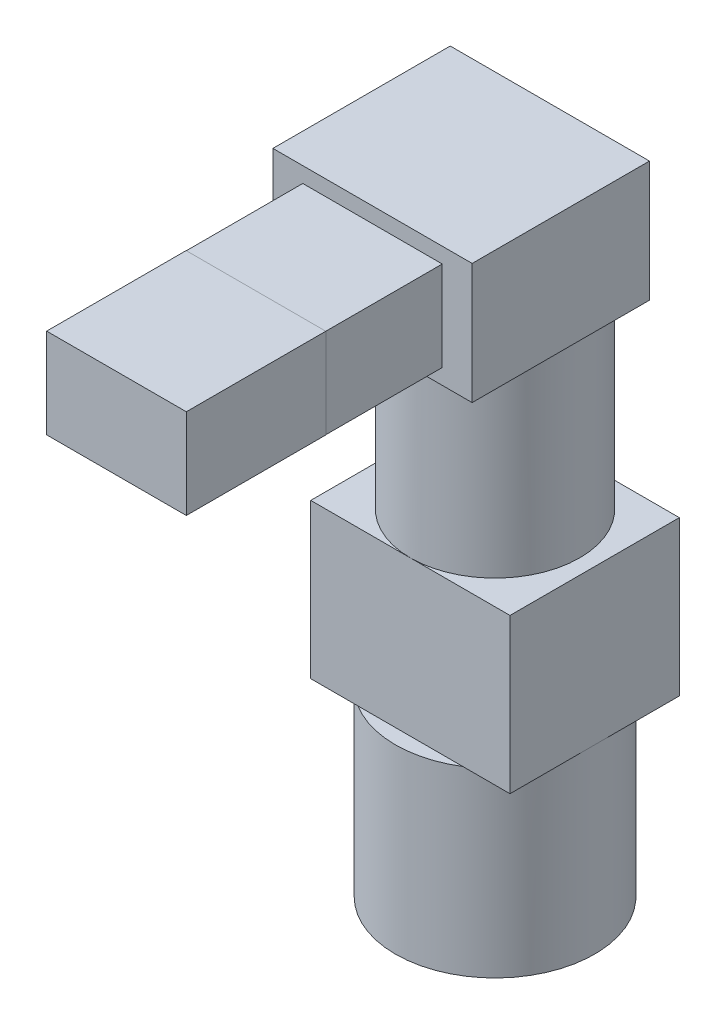
ISO-10303-21;
HEADER;
FILE_DESCRIPTION(('STEP AP214'),'2;1');
FILE_NAME('part.step','',(''),(''),'','','');
FILE_SCHEMA(('AUTOMOTIVE_DESIGN { 1 0 10303 214 1 1 1 1 }'));
ENDSEC;
DATA;
#1=APPLICATION_CONTEXT('core data for automotive mechanical design processes');
#2=APPLICATION_PROTOCOL_DEFINITION('international standard','automotive_design',2000,#1);
#3=PRODUCT_CONTEXT('',#1,'mechanical');
#4=PRODUCT('Part','Part','',(#3));
#5=PRODUCT_RELATED_PRODUCT_CATEGORY('part','',(#4));
#6=PRODUCT_DEFINITION_FORMATION('','',#4);
#7=PRODUCT_DEFINITION_CONTEXT('part definition',#1,'design');
#8=PRODUCT_DEFINITION('design','',#6,#7);
#9=PRODUCT_DEFINITION_SHAPE('','',#8);
#10=(LENGTH_UNIT() NAMED_UNIT(*) SI_UNIT(.MILLI.,.METRE.));
#11=(NAMED_UNIT(*) PLANE_ANGLE_UNIT() SI_UNIT($,.RADIAN.));
#12=(NAMED_UNIT(*) SI_UNIT($,.STERADIAN.) SOLID_ANGLE_UNIT());
#13=UNCERTAINTY_MEASURE_WITH_UNIT(LENGTH_MEASURE(1.E-05),#10,'distance_accuracy_value','');
#14=(GEOMETRIC_REPRESENTATION_CONTEXT(3) GLOBAL_UNCERTAINTY_ASSIGNED_CONTEXT((#13)) GLOBAL_UNIT_ASSIGNED_CONTEXT((#10,
#11,#12)) REPRESENTATION_CONTEXT('',''));
#15=CARTESIAN_POINT('',(0.,0.,0.));
#16=DIRECTION('',(0.,0.,1.));
#17=DIRECTION('',(1.,0.,0.));
#18=AXIS2_PLACEMENT_3D('',#15,#16,#17);
#19=CARTESIAN_POINT('',(0.,270.5,0.));
#20=DIRECTION('',(0.,1.,0.));
#21=DIRECTION('',(0.,0.,1.));
#22=AXIS2_PLACEMENT_3D('',#19,#20,#21);
#23=PLANE('',#22);
#24=CARTESIAN_POINT('',(0.,270.5,0.));
#25=DIRECTION('',(0.,1.,0.));
#26=DIRECTION('',(0.,0.,1.));
#27=AXIS2_PLACEMENT_3D('',#24,#25,#26);
#28=CIRCLE('',#27,42.5);
#29=CARTESIAN_POINT('',(32.4037034920393,270.5,-27.5));
#30=VERTEX_POINT('',#29);
#31=CARTESIAN_POINT('',(-32.4037034920393,270.5,-27.5));
#32=VERTEX_POINT('',#31);
#33=EDGE_CURVE('E274',#30,#32,#28,.T.);
#34=ORIENTED_EDGE('',*,*,#33,.T.);
#35=DIRECTION('',(1.,0.,0.));
#36=VECTOR('',#35,1.);
#37=CARTESIAN_POINT('',(-50.,270.5,-27.5));
#38=LINE('',#37,#36);
#39=EDGE_CURVE('E11',#32,#30,#38,.T.);
#40=ORIENTED_EDGE('',*,*,#39,.T.);
#41=EDGE_LOOP('',(#34,#40));
#42=FACE_BOUND('',#41,.T.);
#43=ADVANCED_FACE('F36',(#42),#23,.T.);
#44=CARTESIAN_POINT('',(-50.,168.5,-42.5));
#45=DIRECTION('',(0.,1.,0.));
#46=DIRECTION('',(0.,0.,1.));
#47=AXIS2_PLACEMENT_3D('',#44,#45,#46);
#48=PLANE('',#47);
#49=DIRECTION('',(1.,0.,0.));
#50=VECTOR('',#49,1.);
#51=CARTESIAN_POINT('',(-50.,168.5,42.5));
#52=LINE('',#51,#50);
#53=CARTESIAN_POINT('',(-50.,168.5,42.5));
#54=VERTEX_POINT('',#53);
#55=CARTESIAN_POINT('',(0.,168.5,42.5));
#56=VERTEX_POINT('',#55);
#57=EDGE_CURVE('E315',#54,#56,#52,.T.);
#58=ORIENTED_EDGE('',*,*,#57,.T.);
#59=CARTESIAN_POINT('',(0.,168.5,0.));
#60=DIRECTION('',(0.,1.,0.));
#61=DIRECTION('',(0.,0.,1.));
#62=AXIS2_PLACEMENT_3D('',#59,#60,#61);
#63=CIRCLE('',#62,42.5);
#64=CARTESIAN_POINT('',(0.,168.5,-42.5));
#65=VERTEX_POINT('',#64);
#66=EDGE_CURVE('E45',#56,#65,#63,.F.);
#67=ORIENTED_EDGE('',*,*,#66,.T.);
#68=DIRECTION('',(1.,0.,0.));
#69=VECTOR('',#68,1.);
#70=CARTESIAN_POINT('',(-50.,168.5,-42.5));
#71=LINE('',#70,#69);
#72=CARTESIAN_POINT('',(-50.,168.5,-42.5));
#73=VERTEX_POINT('',#72);
#74=EDGE_CURVE('E319',#73,#65,#71,.T.);
#75=ORIENTED_EDGE('',*,*,#74,.F.);
#76=DIRECTION('',(0.,0.,1.));
#77=VECTOR('',#76,1.);
#78=CARTESIAN_POINT('',(-50.,168.5,-42.5));
#79=LINE('',#78,#77);
#80=EDGE_CURVE('E293',#73,#54,#79,.T.);
#81=ORIENTED_EDGE('',*,*,#80,.T.);
#82=EDGE_LOOP('',(#58,#67,#75,#81));
#83=FACE_BOUND('',#82,.T.);
#84=ADVANCED_FACE('F377',(#83),#48,.T.);
#85=CARTESIAN_POINT('',(0.,91.,0.));
#86=DIRECTION('',(0.,1.,0.));
#87=DIRECTION('',(0.,0.,1.));
#88=AXIS2_PLACEMENT_3D('',#85,#86,#87);
#89=PLANE('',#88);
#90=CARTESIAN_POINT('',(0.,91.,0.));
#91=DIRECTION('',(0.,1.,0.));
#92=DIRECTION('',(0.,0.,1.));
#93=AXIS2_PLACEMENT_3D('',#90,#91,#92);
#94=CIRCLE('',#93,50.);
#95=CARTESIAN_POINT('',(26.3391343821318,91.,-42.5));
#96=VERTEX_POINT('',#95);
#97=CARTESIAN_POINT('',(-26.3391343821318,91.,-42.5));
#98=VERTEX_POINT('',#97);
#99=EDGE_CURVE('E338',#96,#98,#94,.T.);
#100=ORIENTED_EDGE('',*,*,#99,.T.);
#101=DIRECTION('',(1.,0.,0.));
#102=VECTOR('',#101,1.);
#103=CARTESIAN_POINT('',(-50.,91.,-42.5));
#104=LINE('',#103,#102);
#105=EDGE_CURVE('E309',#98,#96,#104,.T.);
#106=ORIENTED_EDGE('',*,*,#105,.T.);
#107=EDGE_LOOP('',(#100,#106));
#108=FACE_BOUND('',#107,.T.);
#109=ADVANCED_FACE('F370',(#108),#89,.T.);
#110=CARTESIAN_POINT('',(0.,91.,0.));
#111=DIRECTION('',(0.,-1.,0.));
#112=DIRECTION('',(0.,0.,-1.));
#113=AXIS2_PLACEMENT_3D('',#110,#111,#112);
#114=CYLINDRICAL_SURFACE('',#113,50.);
#115=CARTESIAN_POINT('',(26.3391343821319,91.,42.5));
#116=VERTEX_POINT('',#115);
#117=CARTESIAN_POINT('',(50.,91.,0.));
#118=VERTEX_POINT('',#117);
#119=EDGE_CURVE('E322',#116,#118,#94,.T.);
#120=ORIENTED_EDGE('',*,*,#119,.F.);
#121=CARTESIAN_POINT('',(-26.3391343821318,91.,42.5));
#122=VERTEX_POINT('',#121);
#123=EDGE_CURVE('E325',#122,#116,#94,.T.);
#124=ORIENTED_EDGE('',*,*,#123,.F.);
#125=CARTESIAN_POINT('',(-50.,91.,0.));
#126=VERTEX_POINT('',#125);
#127=EDGE_CURVE('E330',#126,#122,#94,.T.);
#128=ORIENTED_EDGE('',*,*,#127,.F.);
#129=EDGE_CURVE('E335',#98,#126,#94,.T.);
#130=ORIENTED_EDGE('',*,*,#129,.F.);
#131=ORIENTED_EDGE('',*,*,#99,.F.);
#132=EDGE_CURVE('E324',#118,#96,#94,.T.);
#133=ORIENTED_EDGE('',*,*,#132,.F.);
#134=EDGE_LOOP('',(#120,#124,#128,#130,#131,#133));
#135=FACE_BOUND('',#134,.T.);
#136=CARTESIAN_POINT('',(0.,0.,0.));
#137=DIRECTION('',(0.,1.,0.));
#138=DIRECTION('',(0.,0.,1.));
#139=AXIS2_PLACEMENT_3D('',#136,#137,#138);
#140=CIRCLE('',#139,50.);
#141=CARTESIAN_POINT('',(0.,0.,50.));
#142=VERTEX_POINT('',#141);
#143=EDGE_CURVE('E307',#142,#142,#140,.T.);
#144=ORIENTED_EDGE('',*,*,#143,.T.);
#145=EDGE_LOOP('',(#144));
#146=FACE_BOUND('',#145,.T.);
#147=ADVANCED_FACE('F38',(#135,#146),#114,.T.);
#148=DIRECTION('',(1.,0.,0.));
#149=VECTOR('',#148,1.);
#150=CARTESIAN_POINT('',(-50.,91.,42.5));
#151=LINE('',#150,#149);
#152=EDGE_CURVE('E314',#122,#116,#151,.T.);
#153=ORIENTED_EDGE('',*,*,#152,.F.);
#154=ORIENTED_EDGE('',*,*,#123,.T.);
#155=EDGE_LOOP('',(#153,#154));
#156=FACE_BOUND('',#155,.T.);
#157=ADVANCED_FACE('F369',(#156),#89,.T.);
#158=CARTESIAN_POINT('',(0.,0.,0.));
#159=DIRECTION('',(0.,1.,0.));
#160=DIRECTION('',(0.,0.,1.));
#161=AXIS2_PLACEMENT_3D('',#158,#159,#160);
#162=PLANE('',#161);
#163=ORIENTED_EDGE('',*,*,#143,.F.);
#164=EDGE_LOOP('',(#163));
#165=FACE_BOUND('',#164,.T.);
#166=ADVANCED_FACE('F375',(#165),#162,.F.);
#167=CARTESIAN_POINT('',(-50.,91.,-42.5));
#168=DIRECTION('',(0.,-1.,0.));
#169=DIRECTION('',(0.,0.,-1.));
#170=AXIS2_PLACEMENT_3D('',#167,#168,#169);
#171=PLANE('',#170);
#172=CARTESIAN_POINT('',(50.,91.,42.5));
#173=VERTEX_POINT('',#172);
#174=EDGE_CURVE('E313',#116,#173,#151,.T.);
#175=ORIENTED_EDGE('',*,*,#174,.F.);
#176=ORIENTED_EDGE('',*,*,#119,.T.);
#177=DIRECTION('',(0.,0.,-1.));
#178=VECTOR('',#177,1.);
#179=CARTESIAN_POINT('',(50.,91.,-42.5));
#180=LINE('',#179,#178);
#181=EDGE_CURVE('E287',#173,#118,#180,.T.);
#182=ORIENTED_EDGE('',*,*,#181,.F.);
#183=EDGE_LOOP('',(#175,#176,#182));
#184=FACE_BOUND('',#183,.T.);
#185=ADVANCED_FACE('F367',(#184),#171,.T.);
#186=CARTESIAN_POINT('',(50.,91.,-42.5));
#187=VERTEX_POINT('',#186);
#188=EDGE_CURVE('E286',#118,#187,#180,.T.);
#189=ORIENTED_EDGE('',*,*,#188,.F.);
#190=ORIENTED_EDGE('',*,*,#132,.T.);
#191=EDGE_CURVE('E308',#96,#187,#104,.T.);
#192=ORIENTED_EDGE('',*,*,#191,.T.);
#193=EDGE_LOOP('',(#189,#190,#192));
#194=FACE_BOUND('',#193,.T.);
#195=ADVANCED_FACE('F350',(#194),#171,.T.);
#196=CARTESIAN_POINT('',(-50.,91.,-42.5));
#197=VERTEX_POINT('',#196);
#198=EDGE_CURVE('E304',#197,#98,#104,.T.);
#199=ORIENTED_EDGE('',*,*,#198,.T.);
#200=ORIENTED_EDGE('',*,*,#129,.T.);
#201=DIRECTION('',(0.,0.,-1.));
#202=VECTOR('',#201,1.);
#203=CARTESIAN_POINT('',(-50.,91.,-42.5));
#204=LINE('',#203,#202);
#205=EDGE_CURVE('E299',#126,#197,#204,.T.);
#206=ORIENTED_EDGE('',*,*,#205,.T.);
#207=EDGE_LOOP('',(#199,#200,#206));
#208=FACE_BOUND('',#207,.T.);
#209=ADVANCED_FACE('F404',(#208),#171,.T.);
#210=CARTESIAN_POINT('',(-50.,91.,-42.5));
#211=DIRECTION('',(0.,0.,-1.));
#212=DIRECTION('',(-1.,0.,0.));
#213=AXIS2_PLACEMENT_3D('',#210,#211,#212);
#214=PLANE('',#213);
#215=ORIENTED_EDGE('',*,*,#74,.T.);
#216=CARTESIAN_POINT('',(50.,168.5,-42.5));
#217=VERTEX_POINT('',#216);
#218=EDGE_CURVE('E303',#65,#217,#71,.T.);
#219=ORIENTED_EDGE('',*,*,#218,.T.);
#220=DIRECTION('',(0.,1.,0.));
#221=VECTOR('',#220,1.);
#222=CARTESIAN_POINT('',(50.,91.,-42.5));
#223=LINE('',#222,#221);
#224=EDGE_CURVE('E277',#187,#217,#223,.T.);
#225=ORIENTED_EDGE('',*,*,#224,.F.);
#226=ORIENTED_EDGE('',*,*,#191,.F.);
#227=ORIENTED_EDGE('',*,*,#105,.F.);
#228=ORIENTED_EDGE('',*,*,#198,.F.);
#229=DIRECTION('',(0.,1.,0.));
#230=VECTOR('',#229,1.);
#231=CARTESIAN_POINT('',(-50.,91.,-42.5));
#232=LINE('',#231,#230);
#233=EDGE_CURVE('E290',#197,#73,#232,.T.);
#234=ORIENTED_EDGE('',*,*,#233,.T.);
#235=EDGE_LOOP('',(#215,#219,#225,#226,#227,#228,#234));
#236=FACE_BOUND('',#235,.T.);
#237=ADVANCED_FACE('F354',(#236),#214,.T.);
#238=CARTESIAN_POINT('',(-50.,91.,42.5));
#239=VERTEX_POINT('',#238);
#240=EDGE_CURVE('E300',#239,#126,#204,.T.);
#241=ORIENTED_EDGE('',*,*,#240,.T.);
#242=ORIENTED_EDGE('',*,*,#127,.T.);
#243=EDGE_CURVE('E310',#239,#122,#151,.T.);
#244=ORIENTED_EDGE('',*,*,#243,.F.);
#245=EDGE_LOOP('',(#241,#242,#244));
#246=FACE_BOUND('',#245,.T.);
#247=ADVANCED_FACE('F401',(#246),#171,.T.);
#248=CARTESIAN_POINT('',(-50.,91.,42.5));
#249=DIRECTION('',(0.,0.,1.));
#250=DIRECTION('',(1.,0.,0.));
#251=AXIS2_PLACEMENT_3D('',#248,#249,#250);
#252=PLANE('',#251);
#253=CARTESIAN_POINT('',(50.,168.5,42.5));
#254=VERTEX_POINT('',#253);
#255=EDGE_CURVE('E318',#56,#254,#52,.T.);
#256=ORIENTED_EDGE('',*,*,#255,.F.);
#257=ORIENTED_EDGE('',*,*,#57,.F.);
#258=DIRECTION('',(0.,-1.,0.));
#259=VECTOR('',#258,1.);
#260=CARTESIAN_POINT('',(-50.,91.,42.5));
#261=LINE('',#260,#259);
#262=EDGE_CURVE('E296',#54,#239,#261,.T.);
#263=ORIENTED_EDGE('',*,*,#262,.T.);
#264=ORIENTED_EDGE('',*,*,#243,.T.);
#265=ORIENTED_EDGE('',*,*,#152,.T.);
#266=ORIENTED_EDGE('',*,*,#174,.T.);
#267=DIRECTION('',(0.,-1.,0.));
#268=VECTOR('',#267,1.);
#269=CARTESIAN_POINT('',(50.,91.,42.5));
#270=LINE('',#269,#268);
#271=EDGE_CURVE('E283',#254,#173,#270,.T.);
#272=ORIENTED_EDGE('',*,*,#271,.F.);
#273=EDGE_LOOP('',(#256,#257,#263,#264,#265,#266,#272));
#274=FACE_BOUND('',#273,.T.);
#275=ADVANCED_FACE('F361',(#274),#252,.T.);
#276=ORIENTED_EDGE('',*,*,#218,.F.);
#277=EDGE_CURVE('E40',#65,#56,#63,.F.);
#278=ORIENTED_EDGE('',*,*,#277,.T.);
#279=ORIENTED_EDGE('',*,*,#255,.T.);
#280=DIRECTION('',(0.,0.,1.));
#281=VECTOR('',#280,1.);
#282=CARTESIAN_POINT('',(50.,168.5,-42.5));
#283=LINE('',#282,#281);
#284=EDGE_CURVE('E280',#217,#254,#283,.T.);
#285=ORIENTED_EDGE('',*,*,#284,.F.);
#286=EDGE_LOOP('',(#276,#278,#279,#285));
#287=FACE_BOUND('',#286,.T.);
#288=ADVANCED_FACE('F386',(#287),#48,.T.);
#289=CARTESIAN_POINT('',(-50.,0.,0.));
#290=DIRECTION('',(1.,0.,0.));
#291=DIRECTION('',(0.,0.,-1.));
#292=AXIS2_PLACEMENT_3D('',#289,#290,#291);
#293=PLANE('',#292);
#294=ORIENTED_EDGE('',*,*,#233,.F.);
#295=ORIENTED_EDGE('',*,*,#205,.F.);
#296=ORIENTED_EDGE('',*,*,#240,.F.);
#297=ORIENTED_EDGE('',*,*,#262,.F.);
#298=ORIENTED_EDGE('',*,*,#80,.F.);
#299=EDGE_LOOP('',(#294,#295,#296,#297,#298));
#300=FACE_BOUND('',#299,.T.);
#301=ADVANCED_FACE('F397',(#300),#293,.F.);
#302=CARTESIAN_POINT('',(50.,0.,0.));
#303=DIRECTION('',(1.,0.,0.));
#304=DIRECTION('',(0.,0.,-1.));
#305=AXIS2_PLACEMENT_3D('',#302,#303,#304);
#306=PLANE('',#305);
#307=ORIENTED_EDGE('',*,*,#224,.T.);
#308=ORIENTED_EDGE('',*,*,#284,.T.);
#309=ORIENTED_EDGE('',*,*,#271,.T.);
#310=ORIENTED_EDGE('',*,*,#181,.T.);
#311=ORIENTED_EDGE('',*,*,#188,.T.);
#312=EDGE_LOOP('',(#307,#308,#309,#310,#311));
#313=FACE_BOUND('',#312,.T.);
#314=ADVANCED_FACE('F365',(#313),#306,.T.);
#315=CARTESIAN_POINT('',(0.,270.5,0.));
#316=DIRECTION('',(0.,-1.,0.));
#317=DIRECTION('',(0.,0.,-1.));
#318=AXIS2_PLACEMENT_3D('',#315,#316,#317);
#319=CYLINDRICAL_SURFACE('',#318,42.5);
#320=ORIENTED_EDGE('',*,*,#66,.F.);
#321=ORIENTED_EDGE('',*,*,#277,.F.);
#322=EDGE_LOOP('',(#320,#321));
#323=FACE_BOUND('',#322,.T.);
#324=ORIENTED_EDGE('',*,*,#33,.F.);
#325=EDGE_CURVE('E269',#32,#30,#28,.T.);
#326=ORIENTED_EDGE('',*,*,#325,.F.);
#327=EDGE_LOOP('',(#324,#326));
#328=FACE_BOUND('',#327,.T.);
#329=ADVANCED_FACE('F391',(#323,#328),#319,.T.);
#330=CARTESIAN_POINT('',(-50.,331.,61.5));
#331=DIRECTION('',(0.,0.,1.));
#332=DIRECTION('',(0.,-1.,0.));
#333=AXIS2_PLACEMENT_3D('',#330,#331,#332);
#334=PLANE('',#333);
#335=DIRECTION('',(0.,1.,0.));
#336=VECTOR('',#335,1.);
#337=CARTESIAN_POINT('',(35.,323.25,61.5));
#338=LINE('',#337,#336);
#339=CARTESIAN_POINT('',(35.,278.25,61.5));
#340=VERTEX_POINT('',#339);
#341=CARTESIAN_POINT('',(35.,323.25,61.5));
#342=VERTEX_POINT('',#341);
#343=EDGE_CURVE('E55',#340,#342,#338,.T.);
#344=ORIENTED_EDGE('',*,*,#343,.F.);
#345=DIRECTION('',(1.,0.,0.));
#346=VECTOR('',#345,1.);
#347=CARTESIAN_POINT('',(-35.,278.25,61.5));
#348=LINE('',#347,#346);
#349=CARTESIAN_POINT('',(-35.,278.25,61.5));
#350=VERTEX_POINT('',#349);
#351=EDGE_CURVE('E59',#350,#340,#348,.T.);
#352=ORIENTED_EDGE('',*,*,#351,.F.);
#353=DIRECTION('',(0.,-1.,0.));
#354=VECTOR('',#353,1.);
#355=CARTESIAN_POINT('',(-35.,323.25,61.5));
#356=LINE('',#355,#354);
#357=CARTESIAN_POINT('',(-35.,323.25,61.5));
#358=VERTEX_POINT('',#357);
#359=EDGE_CURVE('E228',#358,#350,#356,.T.);
#360=ORIENTED_EDGE('',*,*,#359,.F.);
#361=DIRECTION('',(-1.,0.,0.));
#362=VECTOR('',#361,1.);
#363=CARTESIAN_POINT('',(-35.,323.25,61.5));
#364=LINE('',#363,#362);
#365=EDGE_CURVE('E207',#342,#358,#364,.T.);
#366=ORIENTED_EDGE('',*,*,#365,.F.);
#367=EDGE_LOOP('',(#344,#352,#360,#366));
#368=FACE_BOUND('',#367,.T.);
#369=DIRECTION('',(1.,0.,0.));
#370=VECTOR('',#369,1.);
#371=CARTESIAN_POINT('',(-50.,270.5,61.5));
#372=LINE('',#371,#370);
#373=CARTESIAN_POINT('',(-50.,270.5,61.5));
#374=VERTEX_POINT('',#373);
#375=CARTESIAN_POINT('',(50.,270.5,61.5));
#376=VERTEX_POINT('',#375);
#377=EDGE_CURVE('E266',#374,#376,#372,.T.);
#378=ORIENTED_EDGE('',*,*,#377,.T.);
#379=DIRECTION('',(0.,-1.,0.));
#380=VECTOR('',#379,1.);
#381=CARTESIAN_POINT('',(50.,331.,61.5));
#382=LINE('',#381,#380);
#383=CARTESIAN_POINT('',(50.,331.,61.5));
#384=VERTEX_POINT('',#383);
#385=EDGE_CURVE('E242',#384,#376,#382,.T.);
#386=ORIENTED_EDGE('',*,*,#385,.F.);
#387=DIRECTION('',(1.,0.,0.));
#388=VECTOR('',#387,1.);
#389=CARTESIAN_POINT('',(-50.,331.,61.5));
#390=LINE('',#389,#388);
#391=CARTESIAN_POINT('',(-50.,331.,61.5));
#392=VERTEX_POINT('',#391);
#393=EDGE_CURVE('E267',#392,#384,#390,.T.);
#394=ORIENTED_EDGE('',*,*,#393,.F.);
#395=DIRECTION('',(0.,-1.,0.));
#396=VECTOR('',#395,1.);
#397=CARTESIAN_POINT('',(-50.,331.,61.5));
#398=LINE('',#397,#396);
#399=EDGE_CURVE('E254',#392,#374,#398,.T.);
#400=ORIENTED_EDGE('',*,*,#399,.T.);
#401=EDGE_LOOP('',(#378,#386,#394,#400));
#402=FACE_BOUND('',#401,.T.);
#403=ADVANCED_FACE('F389',(#368,#402),#334,.T.);
#404=CARTESIAN_POINT('',(-50.,331.,61.5));
#405=DIRECTION('',(0.,1.,0.));
#406=DIRECTION('',(0.,0.,1.));
#407=AXIS2_PLACEMENT_3D('',#404,#405,#406);
#408=PLANE('',#407);
#409=ORIENTED_EDGE('',*,*,#393,.T.);
#410=DIRECTION('',(0.,0.,1.));
#411=VECTOR('',#410,1.);
#412=CARTESIAN_POINT('',(50.,331.,61.5));
#413=LINE('',#412,#411);
#414=CARTESIAN_POINT('',(50.,331.,-27.5));
#415=VERTEX_POINT('',#414);
#416=EDGE_CURVE('E251',#415,#384,#413,.T.);
#417=ORIENTED_EDGE('',*,*,#416,.F.);
#418=DIRECTION('',(1.,0.,0.));
#419=VECTOR('',#418,1.);
#420=CARTESIAN_POINT('',(-50.,331.,-27.5));
#421=LINE('',#420,#419);
#422=CARTESIAN_POINT('',(-50.,331.,-27.5));
#423=VERTEX_POINT('',#422);
#424=EDGE_CURVE('E270',#423,#415,#421,.T.);
#425=ORIENTED_EDGE('',*,*,#424,.F.);
#426=DIRECTION('',(0.,0.,1.));
#427=VECTOR('',#426,1.);
#428=CARTESIAN_POINT('',(-50.,331.,61.5));
#429=LINE('',#428,#427);
#430=EDGE_CURVE('E263',#423,#392,#429,.T.);
#431=ORIENTED_EDGE('',*,*,#430,.T.);
#432=EDGE_LOOP('',(#409,#417,#425,#431));
#433=FACE_BOUND('',#432,.T.);
#434=ADVANCED_FACE('F449',(#433),#408,.T.);
#435=CARTESIAN_POINT('',(-50.,331.,-27.5));
#436=DIRECTION('',(0.,0.,-1.));
#437=DIRECTION('',(0.,1.,0.));
#438=AXIS2_PLACEMENT_3D('',#435,#436,#437);
#439=PLANE('',#438);
#440=ORIENTED_EDGE('',*,*,#424,.T.);
#441=DIRECTION('',(0.,1.,0.));
#442=VECTOR('',#441,1.);
#443=CARTESIAN_POINT('',(50.,331.,-27.5));
#444=LINE('',#443,#442);
#445=CARTESIAN_POINT('',(50.,270.5,-27.5));
#446=VERTEX_POINT('',#445);
#447=EDGE_CURVE('E248',#446,#415,#444,.T.);
#448=ORIENTED_EDGE('',*,*,#447,.F.);
#449=EDGE_CURVE('E48',#30,#446,#38,.T.);
#450=ORIENTED_EDGE('',*,*,#449,.F.);
#451=ORIENTED_EDGE('',*,*,#39,.F.);
#452=CARTESIAN_POINT('',(-50.,270.5,-27.5));
#453=VERTEX_POINT('',#452);
#454=EDGE_CURVE('E47',#453,#32,#38,.T.);
#455=ORIENTED_EDGE('',*,*,#454,.F.);
#456=DIRECTION('',(0.,1.,0.));
#457=VECTOR('',#456,1.);
#458=CARTESIAN_POINT('',(-50.,331.,-27.5));
#459=LINE('',#458,#457);
#460=EDGE_CURVE('E260',#453,#423,#459,.T.);
#461=ORIENTED_EDGE('',*,*,#460,.T.);
#462=EDGE_LOOP('',(#440,#448,#450,#451,#455,#461));
#463=FACE_BOUND('',#462,.T.);
#464=ADVANCED_FACE('F434',(#463),#439,.T.);
#465=CARTESIAN_POINT('',(-50.,270.5,61.5));
#466=DIRECTION('',(0.,-1.,0.));
#467=DIRECTION('',(0.,0.,-1.));
#468=AXIS2_PLACEMENT_3D('',#465,#466,#467);
#469=PLANE('',#468);
#470=ORIENTED_EDGE('',*,*,#454,.T.);
#471=ORIENTED_EDGE('',*,*,#325,.T.);
#472=ORIENTED_EDGE('',*,*,#449,.T.);
#473=DIRECTION('',(0.,0.,-1.));
#474=VECTOR('',#473,1.);
#475=CARTESIAN_POINT('',(50.,270.5,61.5));
#476=LINE('',#475,#474);
#477=EDGE_CURVE('E245',#376,#446,#476,.T.);
#478=ORIENTED_EDGE('',*,*,#477,.F.);
#479=ORIENTED_EDGE('',*,*,#377,.F.);
#480=DIRECTION('',(0.,0.,-1.));
#481=VECTOR('',#480,1.);
#482=CARTESIAN_POINT('',(-50.,270.5,61.5));
#483=LINE('',#482,#481);
#484=EDGE_CURVE('E257',#374,#453,#483,.T.);
#485=ORIENTED_EDGE('',*,*,#484,.T.);
#486=EDGE_LOOP('',(#470,#471,#472,#478,#479,#485));
#487=FACE_BOUND('',#486,.T.);
#488=ADVANCED_FACE('F438',(#487),#469,.T.);
#489=CARTESIAN_POINT('',(-50.,0.,0.));
#490=DIRECTION('',(1.,0.,0.));
#491=DIRECTION('',(0.,0.,-1.));
#492=AXIS2_PLACEMENT_3D('',#489,#490,#491);
#493=PLANE('',#492);
#494=ORIENTED_EDGE('',*,*,#399,.F.);
#495=ORIENTED_EDGE('',*,*,#430,.F.);
#496=ORIENTED_EDGE('',*,*,#460,.F.);
#497=ORIENTED_EDGE('',*,*,#484,.F.);
#498=EDGE_LOOP('',(#494,#495,#496,#497));
#499=FACE_BOUND('',#498,.T.);
#500=ADVANCED_FACE('F443',(#499),#493,.F.);
#501=CARTESIAN_POINT('',(50.,0.,0.));
#502=DIRECTION('',(1.,0.,0.));
#503=DIRECTION('',(0.,0.,-1.));
#504=AXIS2_PLACEMENT_3D('',#501,#502,#503);
#505=PLANE('',#504);
#506=ORIENTED_EDGE('',*,*,#385,.T.);
#507=ORIENTED_EDGE('',*,*,#477,.T.);
#508=ORIENTED_EDGE('',*,*,#447,.T.);
#509=ORIENTED_EDGE('',*,*,#416,.T.);
#510=EDGE_LOOP('',(#506,#507,#508,#509));
#511=FACE_BOUND('',#510,.T.);
#512=ADVANCED_FACE('F451',(#511),#505,.T.);
#513=CARTESIAN_POINT('',(35.,323.25,120.));
#514=DIRECTION('',(-1.,0.,0.));
#515=DIRECTION('',(0.,0.,1.));
#516=AXIS2_PLACEMENT_3D('',#513,#514,#515);
#517=PLANE('',#516);
#518=ORIENTED_EDGE('',*,*,#343,.T.);
#519=DIRECTION('',(0.,0.,-1.));
#520=VECTOR('',#519,1.);
#521=CARTESIAN_POINT('',(35.,323.25,120.));
#522=LINE('',#521,#520);
#523=CARTESIAN_POINT('',(35.,323.25,120.));
#524=VERTEX_POINT('',#523);
#525=EDGE_CURVE('E239',#524,#342,#522,.T.);
#526=ORIENTED_EDGE('',*,*,#525,.F.);
#527=DIRECTION('',(0.,1.,0.));
#528=VECTOR('',#527,1.);
#529=CARTESIAN_POINT('',(35.,323.25,120.));
#530=LINE('',#529,#528);
#531=CARTESIAN_POINT('',(35.,278.25,120.));
#532=VERTEX_POINT('',#531);
#533=EDGE_CURVE('E213',#532,#524,#530,.T.);
#534=ORIENTED_EDGE('',*,*,#533,.F.);
#535=DIRECTION('',(0.,0.,-1.));
#536=VECTOR('',#535,1.);
#537=CARTESIAN_POINT('',(35.,278.25,120.));
#538=LINE('',#537,#536);
#539=EDGE_CURVE('E224',#532,#340,#538,.T.);
#540=ORIENTED_EDGE('',*,*,#539,.T.);
#541=EDGE_LOOP('',(#518,#526,#534,#540));
#542=FACE_BOUND('',#541,.T.);
#543=ADVANCED_FACE('F453',(#542),#517,.F.);
#544=CARTESIAN_POINT('',(-35.,323.25,120.));
#545=DIRECTION('',(0.,-1.,0.));
#546=DIRECTION('',(0.,0.,-1.));
#547=AXIS2_PLACEMENT_3D('',#544,#545,#546);
#548=PLANE('',#547);
#549=ORIENTED_EDGE('',*,*,#365,.T.);
#550=DIRECTION('',(0.,0.,-1.));
#551=VECTOR('',#550,1.);
#552=CARTESIAN_POINT('',(-35.,323.25,120.));
#553=LINE('',#552,#551);
#554=CARTESIAN_POINT('',(-35.,323.25,120.));
#555=VERTEX_POINT('',#554);
#556=EDGE_CURVE('E236',#555,#358,#553,.T.);
#557=ORIENTED_EDGE('',*,*,#556,.F.);
#558=DIRECTION('',(-1.,0.,0.));
#559=VECTOR('',#558,1.);
#560=CARTESIAN_POINT('',(-35.,323.25,120.));
#561=LINE('',#560,#559);
#562=EDGE_CURVE('E216',#524,#555,#561,.T.);
#563=ORIENTED_EDGE('',*,*,#562,.F.);
#564=ORIENTED_EDGE('',*,*,#525,.T.);
#565=EDGE_LOOP('',(#549,#557,#563,#564));
#566=FACE_BOUND('',#565,.T.);
#567=ADVANCED_FACE('F459',(#566),#548,.F.);
#568=CARTESIAN_POINT('',(-35.,323.25,120.));
#569=DIRECTION('',(1.,0.,0.));
#570=DIRECTION('',(0.,0.,-1.));
#571=AXIS2_PLACEMENT_3D('',#568,#569,#570);
#572=PLANE('',#571);
#573=ORIENTED_EDGE('',*,*,#359,.T.);
#574=DIRECTION('',(0.,0.,-1.));
#575=VECTOR('',#574,1.);
#576=CARTESIAN_POINT('',(-35.,278.25,120.));
#577=LINE('',#576,#575);
#578=CARTESIAN_POINT('',(-35.,278.25,120.));
#579=VERTEX_POINT('',#578);
#580=EDGE_CURVE('E233',#579,#350,#577,.T.);
#581=ORIENTED_EDGE('',*,*,#580,.F.);
#582=DIRECTION('',(0.,-1.,0.));
#583=VECTOR('',#582,1.);
#584=CARTESIAN_POINT('',(-35.,323.25,120.));
#585=LINE('',#584,#583);
#586=EDGE_CURVE('E219',#555,#579,#585,.T.);
#587=ORIENTED_EDGE('',*,*,#586,.F.);
#588=ORIENTED_EDGE('',*,*,#556,.T.);
#589=EDGE_LOOP('',(#573,#581,#587,#588));
#590=FACE_BOUND('',#589,.T.);
#591=ADVANCED_FACE('F505',(#590),#572,.F.);
#592=CARTESIAN_POINT('',(-35.,278.25,120.));
#593=DIRECTION('',(0.,1.,0.));
#594=DIRECTION('',(0.,0.,1.));
#595=AXIS2_PLACEMENT_3D('',#592,#593,#594);
#596=PLANE('',#595);
#597=ORIENTED_EDGE('',*,*,#351,.T.);
#598=ORIENTED_EDGE('',*,*,#539,.F.);
#599=DIRECTION('',(1.,0.,0.));
#600=VECTOR('',#599,1.);
#601=CARTESIAN_POINT('',(-35.,278.25,120.));
#602=LINE('',#601,#600);
#603=EDGE_CURVE('E222',#579,#532,#602,.T.);
#604=ORIENTED_EDGE('',*,*,#603,.F.);
#605=ORIENTED_EDGE('',*,*,#580,.T.);
#606=EDGE_LOOP('',(#597,#598,#604,#605));
#607=FACE_BOUND('',#606,.T.);
#608=ADVANCED_FACE('F514',(#607),#596,.F.);
#609=CARTESIAN_POINT('',(0.,0.,120.));
#610=DIRECTION('',(0.,0.,1.));
#611=DIRECTION('',(1.,0.,0.));
#612=AXIS2_PLACEMENT_3D('',#609,#610,#611);
#613=PLANE('',#612);
#614=DIRECTION('',(0.,1.,0.));
#615=VECTOR('',#614,1.);
#616=CARTESIAN_POINT('',(35.05,323.3,120.));
#617=LINE('',#616,#615);
#618=CARTESIAN_POINT('',(35.05,278.2,120.));
#619=VERTEX_POINT('',#618);
#620=CARTESIAN_POINT('',(35.05,323.3,120.));
#621=VERTEX_POINT('',#620);
#622=EDGE_CURVE('E205',#619,#621,#617,.T.);
#623=ORIENTED_EDGE('',*,*,#622,.F.);
#624=DIRECTION('',(1.,0.,0.));
#625=VECTOR('',#624,1.);
#626=CARTESIAN_POINT('',(-35.05,278.2,120.));
#627=LINE('',#626,#625);
#628=CARTESIAN_POINT('',(-35.05,278.2,120.));
#629=VERTEX_POINT('',#628);
#630=EDGE_CURVE('E201',#629,#619,#627,.T.);
#631=ORIENTED_EDGE('',*,*,#630,.F.);
#632=DIRECTION('',(0.,-1.,0.));
#633=VECTOR('',#632,1.);
#634=CARTESIAN_POINT('',(-35.05,323.3,120.));
#635=LINE('',#634,#633);
#636=CARTESIAN_POINT('',(-35.05,323.3,120.));
#637=VERTEX_POINT('',#636);
#638=EDGE_CURVE('E587',#637,#629,#635,.T.);
#639=ORIENTED_EDGE('',*,*,#638,.F.);
#640=DIRECTION('',(-1.,0.,0.));
#641=VECTOR('',#640,1.);
#642=CARTESIAN_POINT('',(-35.05,323.3,120.));
#643=LINE('',#642,#641);
#644=EDGE_CURVE('E591',#621,#637,#643,.T.);
#645=ORIENTED_EDGE('',*,*,#644,.F.);
#646=EDGE_LOOP('',(#623,#631,#639,#645));
#647=FACE_BOUND('',#646,.T.);
#648=ORIENTED_EDGE('',*,*,#603,.T.);
#649=ORIENTED_EDGE('',*,*,#533,.T.);
#650=ORIENTED_EDGE('',*,*,#562,.T.);
#651=ORIENTED_EDGE('',*,*,#586,.T.);
#652=EDGE_LOOP('',(#648,#649,#650,#651));
#653=FACE_BOUND('',#652,.T.);
#654=ADVANCED_FACE('F524',(#647,#653),#613,.F.);
#655=CARTESIAN_POINT('',(35.05,323.3,190.));
#656=DIRECTION('',(-1.,0.,0.));
#657=DIRECTION('',(0.,-1.,0.));
#658=AXIS2_PLACEMENT_3D('',#655,#656,#657);
#659=PLANE('',#658);
#660=ORIENTED_EDGE('',*,*,#622,.T.);
#661=DIRECTION('',(0.,0.,-1.));
#662=VECTOR('',#661,1.);
#663=CARTESIAN_POINT('',(35.05,323.3,190.));
#664=LINE('',#663,#662);
#665=CARTESIAN_POINT('',(35.05,323.3,190.));
#666=VERTEX_POINT('',#665);
#667=EDGE_CURVE('E185',#666,#621,#664,.T.);
#668=ORIENTED_EDGE('',*,*,#667,.F.);
#669=DIRECTION('',(0.,1.,0.));
#670=VECTOR('',#669,1.);
#671=CARTESIAN_POINT('',(35.05,323.3,190.));
#672=LINE('',#671,#670);
#673=CARTESIAN_POINT('',(35.05,278.2,190.));
#674=VERTEX_POINT('',#673);
#675=EDGE_CURVE('E192',#674,#666,#672,.T.);
#676=ORIENTED_EDGE('',*,*,#675,.F.);
#677=DIRECTION('',(0.,0.,-1.));
#678=VECTOR('',#677,1.);
#679=CARTESIAN_POINT('',(35.05,278.2,190.));
#680=LINE('',#679,#678);
#681=EDGE_CURVE('E584',#674,#619,#680,.T.);
#682=ORIENTED_EDGE('',*,*,#681,.T.);
#683=EDGE_LOOP('',(#660,#668,#676,#682));
#684=FACE_BOUND('',#683,.T.);
#685=ADVANCED_FACE('F203',(#684),#659,.F.);
#686=CARTESIAN_POINT('',(-35.05,323.3,190.));
#687=DIRECTION('',(0.,-1.,0.));
#688=DIRECTION('',(0.,0.,-1.));
#689=AXIS2_PLACEMENT_3D('',#686,#687,#688);
#690=PLANE('',#689);
#691=ORIENTED_EDGE('',*,*,#644,.T.);
#692=DIRECTION('',(0.,0.,-1.));
#693=VECTOR('',#692,1.);
#694=CARTESIAN_POINT('',(-35.05,323.3,190.));
#695=LINE('',#694,#693);
#696=CARTESIAN_POINT('',(-35.05,323.3,190.));
#697=VERTEX_POINT('',#696);
#698=EDGE_CURVE('E188',#697,#637,#695,.T.);
#699=ORIENTED_EDGE('',*,*,#698,.F.);
#700=DIRECTION('',(-1.,0.,0.));
#701=VECTOR('',#700,1.);
#702=CARTESIAN_POINT('',(-35.05,323.3,190.));
#703=LINE('',#702,#701);
#704=EDGE_CURVE('E181',#666,#697,#703,.T.);
#705=ORIENTED_EDGE('',*,*,#704,.F.);
#706=ORIENTED_EDGE('',*,*,#667,.T.);
#707=EDGE_LOOP('',(#691,#699,#705,#706));
#708=FACE_BOUND('',#707,.T.);
#709=ADVANCED_FACE('F183',(#708),#690,.F.);
#710=CARTESIAN_POINT('',(-35.05,323.3,190.));
#711=DIRECTION('',(1.,0.,0.));
#712=DIRECTION('',(0.,1.,0.));
#713=AXIS2_PLACEMENT_3D('',#710,#711,#712);
#714=PLANE('',#713);
#715=ORIENTED_EDGE('',*,*,#638,.T.);
#716=DIRECTION('',(0.,0.,-1.));
#717=VECTOR('',#716,1.);
#718=CARTESIAN_POINT('',(-35.05,278.2,190.));
#719=LINE('',#718,#717);
#720=CARTESIAN_POINT('',(-35.05,278.2,190.));
#721=VERTEX_POINT('',#720);
#722=EDGE_CURVE('E209',#721,#629,#719,.T.);
#723=ORIENTED_EDGE('',*,*,#722,.F.);
#724=DIRECTION('',(0.,-1.,0.));
#725=VECTOR('',#724,1.);
#726=CARTESIAN_POINT('',(-35.05,323.3,190.));
#727=LINE('',#726,#725);
#728=EDGE_CURVE('E191',#697,#721,#727,.T.);
#729=ORIENTED_EDGE('',*,*,#728,.F.);
#730=ORIENTED_EDGE('',*,*,#698,.T.);
#731=EDGE_LOOP('',(#715,#723,#729,#730));
#732=FACE_BOUND('',#731,.T.);
#733=ADVANCED_FACE('F551',(#732),#714,.F.);
#734=CARTESIAN_POINT('',(-35.05,278.2,190.));
#735=DIRECTION('',(0.,1.,0.));
#736=DIRECTION('',(0.,0.,1.));
#737=AXIS2_PLACEMENT_3D('',#734,#735,#736);
#738=PLANE('',#737);
#739=ORIENTED_EDGE('',*,*,#630,.T.);
#740=ORIENTED_EDGE('',*,*,#681,.F.);
#741=DIRECTION('',(1.,0.,0.));
#742=VECTOR('',#741,1.);
#743=CARTESIAN_POINT('',(-35.05,278.2,190.));
#744=LINE('',#743,#742);
#745=EDGE_CURVE('E197',#721,#674,#744,.T.);
#746=ORIENTED_EDGE('',*,*,#745,.F.);
#747=ORIENTED_EDGE('',*,*,#722,.T.);
#748=EDGE_LOOP('',(#739,#740,#746,#747));
#749=FACE_BOUND('',#748,.T.);
#750=ADVANCED_FACE('F560',(#749),#738,.F.);
#751=CARTESIAN_POINT('',(0.,0.,190.));
#752=DIRECTION('',(0.,0.,1.));
#753=DIRECTION('',(1.,0.,0.));
#754=AXIS2_PLACEMENT_3D('',#751,#752,#753);
#755=PLANE('',#754);
#756=ORIENTED_EDGE('',*,*,#675,.T.);
#757=ORIENTED_EDGE('',*,*,#704,.T.);
#758=ORIENTED_EDGE('',*,*,#728,.T.);
#759=ORIENTED_EDGE('',*,*,#745,.T.);
#760=EDGE_LOOP('',(#756,#757,#758,#759));
#761=FACE_BOUND('',#760,.T.);
#762=ADVANCED_FACE('F195',(#761),#755,.T.);
#763=CLOSED_SHELL('',(#43,#84,#109,#147,#157,#166,#185,#195,#209,#237,#247,#275,#288,#301,#314,
#329,#403,#434,#464,#488,#500,#512,#543,#567,#591,#608,#654,#685,#709,#733,#750,#762));
#764=MANIFOLD_SOLID_BREP('B2',#763);
#765=ADVANCED_BREP_SHAPE_REPRESENTATION('',(#18,#764),#14);
#766=SHAPE_DEFINITION_REPRESENTATION(#9,#765);
ENDSEC;
END-ISO-10303-21;
